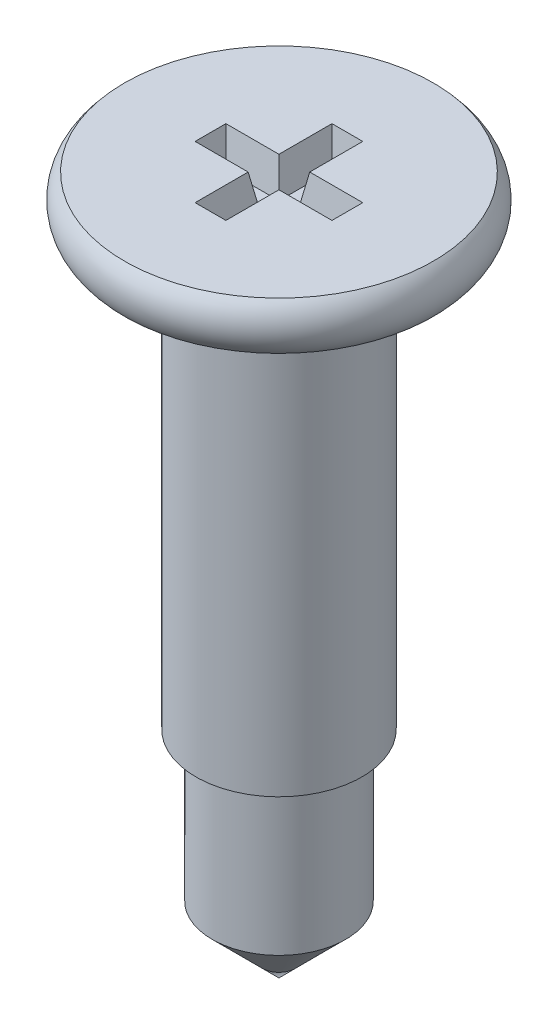
ISO-10303-21;
HEADER;
FILE_DESCRIPTION(('STEP AP214'),'2;1');
FILE_NAME('part.step','',(''),(''),'','','');
FILE_SCHEMA(('AUTOMOTIVE_DESIGN { 1 0 10303 214 1 1 1 1 }'));
ENDSEC;
DATA;
#1=APPLICATION_CONTEXT('core data for automotive mechanical design processes');
#2=APPLICATION_PROTOCOL_DEFINITION('international standard','automotive_design',2000,#1);
#3=PRODUCT_CONTEXT('',#1,'mechanical');
#4=PRODUCT('Part','Part','',(#3));
#5=PRODUCT_RELATED_PRODUCT_CATEGORY('part','',(#4));
#6=PRODUCT_DEFINITION_FORMATION('','',#4);
#7=PRODUCT_DEFINITION_CONTEXT('part definition',#1,'design');
#8=PRODUCT_DEFINITION('design','',#6,#7);
#9=PRODUCT_DEFINITION_SHAPE('','',#8);
#10=(LENGTH_UNIT() NAMED_UNIT(*) SI_UNIT(.MILLI.,.METRE.));
#11=(NAMED_UNIT(*) PLANE_ANGLE_UNIT() SI_UNIT($,.RADIAN.));
#12=(NAMED_UNIT(*) SI_UNIT($,.STERADIAN.) SOLID_ANGLE_UNIT());
#13=UNCERTAINTY_MEASURE_WITH_UNIT(LENGTH_MEASURE(1.E-05),#10,'distance_accuracy_value','');
#14=(GEOMETRIC_REPRESENTATION_CONTEXT(3) GLOBAL_UNCERTAINTY_ASSIGNED_CONTEXT((#13)) GLOBAL_UNIT_ASSIGNED_CONTEXT((#10,
#11,#12)) REPRESENTATION_CONTEXT('',''));
#15=CARTESIAN_POINT('',(0.,0.,0.));
#16=DIRECTION('',(0.,0.,1.));
#17=DIRECTION('',(1.,0.,0.));
#18=AXIS2_PLACEMENT_3D('',#15,#16,#17);
#19=CARTESIAN_POINT('',(-2.42500000000001,0.,0.));
#20=DIRECTION('',(0.,-1.,0.));
#21=DIRECTION('',(1.,0.,0.));
#22=AXIS2_PLACEMENT_3D('',#19,#20,#21);
#23=PLANE('',#22);
#24=CARTESIAN_POINT('',(0.,0.,0.));
#25=DIRECTION('',(0.,1.,0.));
#26=DIRECTION('',(-1.,0.,0.));
#27=AXIS2_PLACEMENT_3D('',#24,#25,#26);
#28=CIRCLE('',#27,2.425);
#29=CARTESIAN_POINT('',(-2.425,0.,0.));
#30=VERTEX_POINT('',#29);
#31=EDGE_CURVE('E192',#30,#30,#28,.T.);
#32=ORIENTED_EDGE('',*,*,#31,.T.);
#33=EDGE_LOOP('',(#32));
#34=FACE_BOUND('',#33,.T.);
#35=CARTESIAN_POINT('',(0.,0.,0.));
#36=DIRECTION('',(0.,1.,0.));
#37=DIRECTION('',(-1.,0.,0.));
#38=AXIS2_PLACEMENT_3D('',#35,#36,#37);
#39=CIRCLE('',#38,4.51414284285428);
#40=CARTESIAN_POINT('',(-4.51414284285428,0.,0.));
#41=VERTEX_POINT('',#40);
#42=EDGE_CURVE('E13',#41,#41,#39,.T.);
#43=ORIENTED_EDGE('',*,*,#42,.F.);
#44=EDGE_LOOP('',(#43));
#45=FACE_BOUND('',#44,.T.);
#46=ADVANCED_FACE('F49',(#34,#45),#23,.T.);
#47=CARTESIAN_POINT('',(0.,0.699999999999923,0.));
#48=DIRECTION('',(0.,1.,0.));
#49=DIRECTION('',(-1.,0.,0.));
#50=AXIS2_PLACEMENT_3D('',#47,#48,#49);
#51=TOROIDAL_SURFACE('',#50,3.8,1.);
#52=ORIENTED_EDGE('',*,*,#42,.T.);
#53=EDGE_LOOP('',(#52));
#54=FACE_BOUND('',#53,.T.);
#55=CARTESIAN_POINT('',(0.,1.40000000000007,0.));
#56=DIRECTION('',(0.,1.,0.));
#57=DIRECTION('',(-1.,0.,0.));
#58=AXIS2_PLACEMENT_3D('',#55,#56,#57);
#59=CIRCLE('',#58,4.51414284285428);
#60=CARTESIAN_POINT('',(-4.51414284285428,1.40000000000007,0.));
#61=VERTEX_POINT('',#60);
#62=EDGE_CURVE('E56',#61,#61,#59,.T.);
#63=ORIENTED_EDGE('',*,*,#62,.F.);
#64=EDGE_LOOP('',(#63));
#65=FACE_BOUND('',#64,.T.);
#66=ADVANCED_FACE('F256',(#54,#65),#51,.T.);
#67=CARTESIAN_POINT('',(-4.51414284285429,1.40000000000007,0.));
#68=DIRECTION('',(0.,1.,0.));
#69=DIRECTION('',(-1.,0.,0.));
#70=AXIS2_PLACEMENT_3D('',#67,#68,#69);
#71=PLANE('',#70);
#72=DIRECTION('',(-1.,0.,0.));
#73=VECTOR('',#72,1.);
#74=CARTESIAN_POINT('',(-0.450000000000006,1.40000000000007,-2.));
#75=LINE('',#74,#73);
#76=CARTESIAN_POINT('',(0.450000000000006,1.40000000000007,-2.));
#77=VERTEX_POINT('',#76);
#78=CARTESIAN_POINT('',(-0.450000000000006,1.40000000000007,-2.));
#79=VERTEX_POINT('',#78);
#80=EDGE_CURVE('E63',#77,#79,#75,.T.);
#81=ORIENTED_EDGE('',*,*,#80,.F.);
#82=DIRECTION('',(0.,0.,-1.));
#83=VECTOR('',#82,1.);
#84=CARTESIAN_POINT('',(0.450000000000006,1.40000000000007,-2.));
#85=LINE('',#84,#83);
#86=CARTESIAN_POINT('',(0.450000000000006,1.40000000000007,-0.450000000000006));
#87=VERTEX_POINT('',#86);
#88=EDGE_CURVE('E186',#87,#77,#85,.T.);
#89=ORIENTED_EDGE('',*,*,#88,.F.);
#90=DIRECTION('',(-1.,0.,0.));
#91=VECTOR('',#90,1.);
#92=CARTESIAN_POINT('',(0.450000000000006,1.40000000000007,-0.450000000000006));
#93=LINE('',#92,#91);
#94=CARTESIAN_POINT('',(2.,1.40000000000007,-0.450000000000006));
#95=VERTEX_POINT('',#94);
#96=EDGE_CURVE('E183',#95,#87,#93,.T.);
#97=ORIENTED_EDGE('',*,*,#96,.F.);
#98=DIRECTION('',(0.,0.,-1.));
#99=VECTOR('',#98,1.);
#100=CARTESIAN_POINT('',(2.,1.40000000000007,0.450000000000006));
#101=LINE('',#100,#99);
#102=CARTESIAN_POINT('',(2.,1.40000000000007,0.450000000000006));
#103=VERTEX_POINT('',#102);
#104=EDGE_CURVE('E180',#103,#95,#101,.T.);
#105=ORIENTED_EDGE('',*,*,#104,.F.);
#106=DIRECTION('',(1.,0.,0.));
#107=VECTOR('',#106,1.);
#108=CARTESIAN_POINT('',(0.450000000000006,1.40000000000007,0.450000000000006));
#109=LINE('',#108,#107);
#110=CARTESIAN_POINT('',(0.450000000000006,1.40000000000007,0.450000000000006));
#111=VERTEX_POINT('',#110);
#112=EDGE_CURVE('E177',#111,#103,#109,.T.);
#113=ORIENTED_EDGE('',*,*,#112,.F.);
#114=DIRECTION('',(0.,0.,-1.));
#115=VECTOR('',#114,1.);
#116=CARTESIAN_POINT('',(0.450000000000006,1.40000000000007,2.));
#117=LINE('',#116,#115);
#118=CARTESIAN_POINT('',(0.450000000000006,1.40000000000007,2.));
#119=VERTEX_POINT('',#118);
#120=EDGE_CURVE('E174',#119,#111,#117,.T.);
#121=ORIENTED_EDGE('',*,*,#120,.F.);
#122=DIRECTION('',(1.,0.,0.));
#123=VECTOR('',#122,1.);
#124=CARTESIAN_POINT('',(-0.450000000000006,1.40000000000007,2.));
#125=LINE('',#124,#123);
#126=CARTESIAN_POINT('',(-0.450000000000006,1.40000000000007,2.));
#127=VERTEX_POINT('',#126);
#128=EDGE_CURVE('E171',#127,#119,#125,.T.);
#129=ORIENTED_EDGE('',*,*,#128,.F.);
#130=DIRECTION('',(0.,0.,1.));
#131=VECTOR('',#130,1.);
#132=CARTESIAN_POINT('',(-0.450000000000006,1.40000000000007,2.));
#133=LINE('',#132,#131);
#134=CARTESIAN_POINT('',(-0.450000000000006,1.40000000000007,0.450000000000006));
#135=VERTEX_POINT('',#134);
#136=EDGE_CURVE('E168',#135,#127,#133,.T.);
#137=ORIENTED_EDGE('',*,*,#136,.F.);
#138=DIRECTION('',(1.,0.,0.));
#139=VECTOR('',#138,1.);
#140=CARTESIAN_POINT('',(-0.450000000000006,1.40000000000007,0.450000000000006));
#141=LINE('',#140,#139);
#142=CARTESIAN_POINT('',(-2.,1.40000000000007,0.450000000000006));
#143=VERTEX_POINT('',#142);
#144=EDGE_CURVE('E162',#143,#135,#141,.T.);
#145=ORIENTED_EDGE('',*,*,#144,.F.);
#146=DIRECTION('',(0.,0.,1.));
#147=VECTOR('',#146,1.);
#148=CARTESIAN_POINT('',(-2.,1.40000000000007,0.450000000000006));
#149=LINE('',#148,#147);
#150=CARTESIAN_POINT('',(-2.,1.40000000000007,-0.450000000000006));
#151=VERTEX_POINT('',#150);
#152=EDGE_CURVE('E160',#151,#143,#149,.T.);
#153=ORIENTED_EDGE('',*,*,#152,.F.);
#154=DIRECTION('',(-1.,0.,0.));
#155=VECTOR('',#154,1.);
#156=CARTESIAN_POINT('',(-0.450000000000006,1.40000000000007,-0.450000000000006));
#157=LINE('',#156,#155);
#158=CARTESIAN_POINT('',(-0.450000000000006,1.40000000000007,-0.450000000000006));
#159=VERTEX_POINT('',#158);
#160=EDGE_CURVE('E141',#159,#151,#157,.T.);
#161=ORIENTED_EDGE('',*,*,#160,.F.);
#162=DIRECTION('',(0.,0.,1.));
#163=VECTOR('',#162,1.);
#164=CARTESIAN_POINT('',(-0.450000000000006,1.40000000000007,-2.));
#165=LINE('',#164,#163);
#166=EDGE_CURVE('E152',#79,#159,#165,.T.);
#167=ORIENTED_EDGE('',*,*,#166,.F.);
#168=EDGE_LOOP('',(#81,#89,#97,#105,#113,#121,#129,#137,#145,#153,#161,#167));
#169=FACE_BOUND('',#168,.T.);
#170=ORIENTED_EDGE('',*,*,#62,.T.);
#171=EDGE_LOOP('',(#170));
#172=FACE_BOUND('',#171,.T.);
#173=ADVANCED_FACE('F156',(#169,#172),#71,.T.);
#174=CARTESIAN_POINT('',(0.,-17.05,0.));
#175=DIRECTION('',(0.,1.,0.));
#176=DIRECTION('',(-1.,0.,0.));
#177=AXIS2_PLACEMENT_3D('',#174,#175,#176);
#178=CONICAL_SURFACE('',#177,1.95,0.785398163397443);
#179=CARTESIAN_POINT('',(0.,-18.9999999999999,0.));
#180=VERTEX_POINT('',#179);
#181=VERTEX_LOOP('',#180);
#182=FACE_BOUND('',#181,.T.);
#183=CARTESIAN_POINT('',(0.,-17.05,0.));
#184=DIRECTION('',(0.,1.,0.));
#185=DIRECTION('',(-1.,0.,0.));
#186=AXIS2_PLACEMENT_3D('',#183,#184,#185);
#187=CIRCLE('',#186,1.95);
#188=CARTESIAN_POINT('',(-1.95,-17.05,0.));
#189=VERTEX_POINT('',#188);
#190=EDGE_CURVE('E251',#189,#189,#187,.T.);
#191=ORIENTED_EDGE('',*,*,#190,.F.);
#192=EDGE_LOOP('',(#191));
#193=FACE_BOUND('',#192,.T.);
#194=ADVANCED_FACE('F263',(#182,#193),#178,.T.);
#195=CARTESIAN_POINT('',(0.,-18.9999999999999,0.));
#196=DIRECTION('',(0.,1.,0.));
#197=DIRECTION('',(-1.,0.,0.));
#198=AXIS2_PLACEMENT_3D('',#195,#196,#197);
#199=CYLINDRICAL_SURFACE('',#198,1.95);
#200=ORIENTED_EDGE('',*,*,#190,.T.);
#201=EDGE_LOOP('',(#200));
#202=FACE_BOUND('',#201,.T.);
#203=CARTESIAN_POINT('',(0.,-12.6999999999999,0.));
#204=DIRECTION('',(0.,1.,0.));
#205=DIRECTION('',(-1.,0.,0.));
#206=AXIS2_PLACEMENT_3D('',#203,#204,#205);
#207=CIRCLE('',#206,1.95);
#208=CARTESIAN_POINT('',(-1.95,-12.6999999999999,0.));
#209=VERTEX_POINT('',#208);
#210=EDGE_CURVE('E248',#209,#209,#207,.T.);
#211=ORIENTED_EDGE('',*,*,#210,.F.);
#212=EDGE_LOOP('',(#211));
#213=FACE_BOUND('',#212,.T.);
#214=ADVANCED_FACE('F269',(#202,#213),#199,.T.);
#215=CARTESIAN_POINT('',(-2.42500000000001,-12.6999999999999,0.));
#216=DIRECTION('',(0.,-1.,0.));
#217=DIRECTION('',(1.,0.,0.));
#218=AXIS2_PLACEMENT_3D('',#215,#216,#217);
#219=PLANE('',#218);
#220=ORIENTED_EDGE('',*,*,#210,.T.);
#221=EDGE_LOOP('',(#220));
#222=FACE_BOUND('',#221,.T.);
#223=CARTESIAN_POINT('',(0.,-12.6999999999999,0.));
#224=DIRECTION('',(0.,1.,0.));
#225=DIRECTION('',(-1.,0.,0.));
#226=AXIS2_PLACEMENT_3D('',#223,#224,#225);
#227=CIRCLE('',#226,2.425);
#228=CARTESIAN_POINT('',(-2.425,-12.6999999999999,0.));
#229=VERTEX_POINT('',#228);
#230=EDGE_CURVE('E245',#229,#229,#227,.T.);
#231=ORIENTED_EDGE('',*,*,#230,.F.);
#232=EDGE_LOOP('',(#231));
#233=FACE_BOUND('',#232,.T.);
#234=ADVANCED_FACE('F272',(#222,#233),#219,.T.);
#235=CARTESIAN_POINT('',(0.,-18.9999999999999,0.));
#236=DIRECTION('',(0.,1.,0.));
#237=DIRECTION('',(-1.,0.,0.));
#238=AXIS2_PLACEMENT_3D('',#235,#236,#237);
#239=CYLINDRICAL_SURFACE('',#238,2.425);
#240=ORIENTED_EDGE('',*,*,#230,.T.);
#241=EDGE_LOOP('',(#240));
#242=FACE_BOUND('',#241,.T.);
#243=ORIENTED_EDGE('',*,*,#31,.F.);
#244=EDGE_LOOP('',(#243));
#245=FACE_BOUND('',#244,.T.);
#246=ADVANCED_FACE('F276',(#242,#245),#239,.T.);
#247=CARTESIAN_POINT('',(-0.450000000000006,1.40000000000007,-2.));
#248=DIRECTION('',(0.,-0.173648177666931,-0.984807753012208));
#249=DIRECTION('',(0.,0.984807753012208,-0.173648177666931));
#250=AXIS2_PLACEMENT_3D('',#247,#248,#249);
#251=PLANE('',#250);
#252=ORIENTED_EDGE('',*,*,#80,.T.);
#253=DIRECTION('',(-0.171087869746036,0.970287525247813,-0.171087869746036));
#254=VECTOR('',#253,1.);
#255=CARTESIAN_POINT('',(-0.450000000000006,1.40000000000007,-2.));
#256=LINE('',#255,#254);
#257=CARTESIAN_POINT('',(-0.273673019291543,0.399999999999956,-1.82367301929154));
#258=VERTEX_POINT('',#257);
#259=EDGE_CURVE('E149',#258,#79,#256,.T.);
#260=ORIENTED_EDGE('',*,*,#259,.F.);
#261=DIRECTION('',(-1.,0.,0.));
#262=VECTOR('',#261,1.);
#263=CARTESIAN_POINT('',(-0.450000000000006,0.399999999999956,-1.82367301929154));
#264=LINE('',#263,#262);
#265=CARTESIAN_POINT('',(0.273673019291543,0.399999999999956,-1.82367301929154));
#266=VERTEX_POINT('',#265);
#267=EDGE_CURVE('E189',#266,#258,#264,.T.);
#268=ORIENTED_EDGE('',*,*,#267,.F.);
#269=DIRECTION('',(0.171087869746036,0.970287525247814,-0.171087869746036));
#270=VECTOR('',#269,1.);
#271=CARTESIAN_POINT('',(0.450000000000006,1.40000000000007,-2.));
#272=LINE('',#271,#270);
#273=EDGE_CURVE('E190',#266,#77,#272,.T.);
#274=ORIENTED_EDGE('',*,*,#273,.T.);
#275=EDGE_LOOP('',(#252,#260,#268,#274));
#276=FACE_BOUND('',#275,.T.);
#277=ADVANCED_FACE('F280',(#276),#251,.F.);
#278=CARTESIAN_POINT('',(0.450000000000006,1.40000000000007,-2.));
#279=DIRECTION('',(0.984807753012208,-0.173648177666931,0.));
#280=DIRECTION('',(0.173648177666931,0.984807753012208,0.));
#281=AXIS2_PLACEMENT_3D('',#278,#279,#280);
#282=PLANE('',#281);
#283=ORIENTED_EDGE('',*,*,#88,.T.);
#284=ORIENTED_EDGE('',*,*,#273,.F.);
#285=DIRECTION('',(0.,0.,-1.));
#286=VECTOR('',#285,1.);
#287=CARTESIAN_POINT('',(0.273673019291543,0.399999999999956,-2.));
#288=LINE('',#287,#286);
#289=CARTESIAN_POINT('',(0.273673019291543,0.399999999999956,-0.273673019291543));
#290=VERTEX_POINT('',#289);
#291=EDGE_CURVE('E194',#290,#266,#288,.T.);
#292=ORIENTED_EDGE('',*,*,#291,.F.);
#293=DIRECTION('',(0.171087869746036,0.970287525247814,-0.171087869746036));
#294=VECTOR('',#293,1.);
#295=CARTESIAN_POINT('',(0.495370141720075,1.65730685989041,-0.495370141720075));
#296=LINE('',#295,#294);
#297=EDGE_CURVE('E193',#290,#87,#296,.T.);
#298=ORIENTED_EDGE('',*,*,#297,.T.);
#299=EDGE_LOOP('',(#283,#284,#292,#298));
#300=FACE_BOUND('',#299,.T.);
#301=ADVANCED_FACE('F282',(#300),#282,.F.);
#302=CARTESIAN_POINT('',(0.450000000000006,1.40000000000007,-0.450000000000006));
#303=DIRECTION('',(0.,-0.173648177666931,-0.984807753012208));
#304=DIRECTION('',(0.,0.984807753012208,-0.173648177666931));
#305=AXIS2_PLACEMENT_3D('',#302,#303,#304);
#306=PLANE('',#305);
#307=ORIENTED_EDGE('',*,*,#96,.T.);
#308=ORIENTED_EDGE('',*,*,#297,.F.);
#309=DIRECTION('',(-1.,0.,0.));
#310=VECTOR('',#309,1.);
#311=CARTESIAN_POINT('',(0.450000000000006,0.399999999999956,-0.273673019291543));
#312=LINE('',#311,#310);
#313=CARTESIAN_POINT('',(1.82367301929154,0.399999999999956,-0.273673019291543));
#314=VERTEX_POINT('',#313);
#315=EDGE_CURVE('E217',#314,#290,#312,.T.);
#316=ORIENTED_EDGE('',*,*,#315,.F.);
#317=DIRECTION('',(0.171087869746036,0.970287525247814,-0.171087869746036));
#318=VECTOR('',#317,1.);
#319=CARTESIAN_POINT('',(1.97365604674321,1.25059601683786,-0.423656046743215));
#320=LINE('',#319,#318);
#321=EDGE_CURVE('E209',#314,#95,#320,.T.);
#322=ORIENTED_EDGE('',*,*,#321,.T.);
#323=EDGE_LOOP('',(#307,#308,#316,#322));
#324=FACE_BOUND('',#323,.T.);
#325=ADVANCED_FACE('F285',(#324),#306,.F.);
#326=CARTESIAN_POINT('',(2.,1.40000000000007,0.450000000000006));
#327=DIRECTION('',(0.984807753012208,-0.173648177666931,0.));
#328=DIRECTION('',(0.173648177666931,0.984807753012208,0.));
#329=AXIS2_PLACEMENT_3D('',#326,#327,#328);
#330=PLANE('',#329);
#331=ORIENTED_EDGE('',*,*,#104,.T.);
#332=ORIENTED_EDGE('',*,*,#321,.F.);
#333=DIRECTION('',(0.,0.,-1.));
#334=VECTOR('',#333,1.);
#335=CARTESIAN_POINT('',(1.82367301929154,0.399999999999956,0.450000000000006));
#336=LINE('',#335,#334);
#337=CARTESIAN_POINT('',(1.82367301929154,0.399999999999956,0.273673019291543));
#338=VERTEX_POINT('',#337);
#339=EDGE_CURVE('E220',#338,#314,#336,.T.);
#340=ORIENTED_EDGE('',*,*,#339,.F.);
#341=DIRECTION('',(0.171087869746036,0.970287525247814,0.171087869746036));
#342=VECTOR('',#341,1.);
#343=CARTESIAN_POINT('',(1.95462985827993,1.14269314010951,0.404629858279937));
#344=LINE('',#343,#342);
#345=EDGE_CURVE('E207',#338,#103,#344,.T.);
#346=ORIENTED_EDGE('',*,*,#345,.T.);
#347=EDGE_LOOP('',(#331,#332,#340,#346));
#348=FACE_BOUND('',#347,.T.);
#349=ADVANCED_FACE('F289',(#348),#330,.F.);
#350=CARTESIAN_POINT('',(0.450000000000006,1.40000000000007,0.450000000000006));
#351=DIRECTION('',(0.,-0.173648177666931,0.984807753012208));
#352=DIRECTION('',(0.,-0.984807753012208,-0.173648177666931));
#353=AXIS2_PLACEMENT_3D('',#350,#351,#352);
#354=PLANE('',#353);
#355=ORIENTED_EDGE('',*,*,#112,.T.);
#356=ORIENTED_EDGE('',*,*,#345,.F.);
#357=DIRECTION('',(1.,0.,0.));
#358=VECTOR('',#357,1.);
#359=CARTESIAN_POINT('',(0.450000000000006,0.399999999999956,0.273673019291543));
#360=LINE('',#359,#358);
#361=CARTESIAN_POINT('',(0.273673019291543,0.399999999999956,0.273673019291543));
#362=VERTEX_POINT('',#361);
#363=EDGE_CURVE('E223',#362,#338,#360,.T.);
#364=ORIENTED_EDGE('',*,*,#363,.F.);
#365=DIRECTION('',(0.171087869746036,0.970287525247814,0.171087869746036));
#366=VECTOR('',#365,1.);
#367=CARTESIAN_POINT('',(0.450000000000006,1.40000000000007,0.450000000000006));
#368=LINE('',#367,#366);
#369=EDGE_CURVE('E205',#362,#111,#368,.T.);
#370=ORIENTED_EDGE('',*,*,#369,.T.);
#371=EDGE_LOOP('',(#355,#356,#364,#370));
#372=FACE_BOUND('',#371,.T.);
#373=ADVANCED_FACE('F293',(#372),#354,.F.);
#374=CARTESIAN_POINT('',(0.450000000000006,1.40000000000007,2.));
#375=DIRECTION('',(0.984807753012208,-0.173648177666931,0.));
#376=DIRECTION('',(0.173648177666931,0.984807753012208,0.));
#377=AXIS2_PLACEMENT_3D('',#374,#375,#376);
#378=PLANE('',#377);
#379=ORIENTED_EDGE('',*,*,#120,.T.);
#380=ORIENTED_EDGE('',*,*,#369,.F.);
#381=DIRECTION('',(0.,0.,-1.));
#382=VECTOR('',#381,1.);
#383=CARTESIAN_POINT('',(0.273673019291543,0.399999999999956,2.));
#384=LINE('',#383,#382);
#385=CARTESIAN_POINT('',(0.273673019291543,0.399999999999956,1.82367301929154));
#386=VERTEX_POINT('',#385);
#387=EDGE_CURVE('E226',#386,#362,#384,.T.);
#388=ORIENTED_EDGE('',*,*,#387,.F.);
#389=DIRECTION('',(0.171087869746036,0.970287525247814,0.171087869746036));
#390=VECTOR('',#389,1.);
#391=CARTESIAN_POINT('',(0.423656046743159,1.25059601683786,1.97365604674321));
#392=LINE('',#391,#390);
#393=EDGE_CURVE('E203',#386,#119,#392,.T.);
#394=ORIENTED_EDGE('',*,*,#393,.T.);
#395=EDGE_LOOP('',(#379,#380,#388,#394));
#396=FACE_BOUND('',#395,.T.);
#397=ADVANCED_FACE('F297',(#396),#378,.F.);
#398=CARTESIAN_POINT('',(-0.450000000000006,1.40000000000007,2.));
#399=DIRECTION('',(0.,-0.173648177666931,0.984807753012208));
#400=DIRECTION('',(0.,-0.984807753012208,-0.173648177666931));
#401=AXIS2_PLACEMENT_3D('',#398,#399,#400);
#402=PLANE('',#401);
#403=ORIENTED_EDGE('',*,*,#128,.T.);
#404=ORIENTED_EDGE('',*,*,#393,.F.);
#405=DIRECTION('',(1.,0.,0.));
#406=VECTOR('',#405,1.);
#407=CARTESIAN_POINT('',(-0.450000000000006,0.399999999999956,1.82367301929154));
#408=LINE('',#407,#406);
#409=CARTESIAN_POINT('',(-0.273673019291543,0.399999999999956,1.82367301929154));
#410=VERTEX_POINT('',#409);
#411=EDGE_CURVE('E229',#410,#386,#408,.T.);
#412=ORIENTED_EDGE('',*,*,#411,.F.);
#413=DIRECTION('',(-0.171087869746036,0.970287525247814,0.171087869746036));
#414=VECTOR('',#413,1.);
#415=CARTESIAN_POINT('',(-0.450000000000006,1.40000000000007,2.));
#416=LINE('',#415,#414);
#417=EDGE_CURVE('E201',#410,#127,#416,.T.);
#418=ORIENTED_EDGE('',*,*,#417,.T.);
#419=EDGE_LOOP('',(#403,#404,#412,#418));
#420=FACE_BOUND('',#419,.T.);
#421=ADVANCED_FACE('F301',(#420),#402,.F.);
#422=CARTESIAN_POINT('',(-0.450000000000006,1.40000000000007,2.));
#423=DIRECTION('',(-0.984807753012208,-0.173648177666931,0.));
#424=DIRECTION('',(0.173648177666931,-0.984807753012208,0.));
#425=AXIS2_PLACEMENT_3D('',#422,#423,#424);
#426=PLANE('',#425);
#427=ORIENTED_EDGE('',*,*,#136,.T.);
#428=ORIENTED_EDGE('',*,*,#417,.F.);
#429=DIRECTION('',(0.,0.,1.));
#430=VECTOR('',#429,1.);
#431=CARTESIAN_POINT('',(-0.273673019291543,0.399999999999956,2.));
#432=LINE('',#431,#430);
#433=CARTESIAN_POINT('',(-0.273673019291543,0.399999999999956,0.273673019291543));
#434=VERTEX_POINT('',#433);
#435=EDGE_CURVE('E232',#434,#410,#432,.T.);
#436=ORIENTED_EDGE('',*,*,#435,.F.);
#437=DIRECTION('',(-0.171087869746036,0.970287525247814,0.171087869746036));
#438=VECTOR('',#437,1.);
#439=CARTESIAN_POINT('',(-0.495370141720075,1.65730685989041,0.495370141720075));
#440=LINE('',#439,#438);
#441=EDGE_CURVE('E199',#434,#135,#440,.T.);
#442=ORIENTED_EDGE('',*,*,#441,.T.);
#443=EDGE_LOOP('',(#427,#428,#436,#442));
#444=FACE_BOUND('',#443,.T.);
#445=ADVANCED_FACE('F305',(#444),#426,.F.);
#446=CARTESIAN_POINT('',(-0.450000000000006,1.40000000000007,0.450000000000006));
#447=DIRECTION('',(0.,-0.173648177666931,0.984807753012208));
#448=DIRECTION('',(0.,-0.984807753012208,-0.173648177666931));
#449=AXIS2_PLACEMENT_3D('',#446,#447,#448);
#450=PLANE('',#449);
#451=ORIENTED_EDGE('',*,*,#144,.T.);
#452=ORIENTED_EDGE('',*,*,#441,.F.);
#453=DIRECTION('',(1.,0.,0.));
#454=VECTOR('',#453,1.);
#455=CARTESIAN_POINT('',(-0.450000000000006,0.399999999999956,0.273673019291543));
#456=LINE('',#455,#454);
#457=CARTESIAN_POINT('',(-1.82367301929154,0.399999999999956,0.273673019291543));
#458=VERTEX_POINT('',#457);
#459=EDGE_CURVE('E235',#458,#434,#456,.T.);
#460=ORIENTED_EDGE('',*,*,#459,.F.);
#461=DIRECTION('',(-0.171087869746036,0.970287525247814,0.171087869746036));
#462=VECTOR('',#461,1.);
#463=CARTESIAN_POINT('',(-2.,1.40000000000007,0.450000000000006));
#464=LINE('',#463,#462);
#465=EDGE_CURVE('E197',#458,#143,#464,.T.);
#466=ORIENTED_EDGE('',*,*,#465,.T.);
#467=EDGE_LOOP('',(#451,#452,#460,#466));
#468=FACE_BOUND('',#467,.T.);
#469=ADVANCED_FACE('F309',(#468),#450,.F.);
#470=CARTESIAN_POINT('',(-2.,1.40000000000007,0.450000000000006));
#471=DIRECTION('',(-0.984807753012208,-0.173648177666931,0.));
#472=DIRECTION('',(0.173648177666931,-0.984807753012208,0.));
#473=AXIS2_PLACEMENT_3D('',#470,#471,#472);
#474=PLANE('',#473);
#475=ORIENTED_EDGE('',*,*,#152,.T.);
#476=ORIENTED_EDGE('',*,*,#465,.F.);
#477=DIRECTION('',(0.,0.,1.));
#478=VECTOR('',#477,1.);
#479=CARTESIAN_POINT('',(-1.82367301929154,0.399999999999956,0.450000000000006));
#480=LINE('',#479,#478);
#481=CARTESIAN_POINT('',(-1.82367301929154,0.399999999999956,-0.273673019291543));
#482=VERTEX_POINT('',#481);
#483=EDGE_CURVE('E238',#482,#458,#480,.T.);
#484=ORIENTED_EDGE('',*,*,#483,.F.);
#485=DIRECTION('',(-0.171087869746036,0.970287525247813,-0.171087869746036));
#486=VECTOR('',#485,1.);
#487=CARTESIAN_POINT('',(-1.95462985827993,1.14269314010951,-0.404629858279937));
#488=LINE('',#487,#486);
#489=EDGE_CURVE('E148',#482,#151,#488,.T.);
#490=ORIENTED_EDGE('',*,*,#489,.T.);
#491=EDGE_LOOP('',(#475,#476,#484,#490));
#492=FACE_BOUND('',#491,.T.);
#493=ADVANCED_FACE('F313',(#492),#474,.F.);
#494=CARTESIAN_POINT('',(-0.450000000000006,1.40000000000007,-0.450000000000006));
#495=DIRECTION('',(0.,-0.173648177666931,-0.984807753012208));
#496=DIRECTION('',(0.,0.984807753012208,-0.173648177666931));
#497=AXIS2_PLACEMENT_3D('',#494,#495,#496);
#498=PLANE('',#497);
#499=ORIENTED_EDGE('',*,*,#160,.T.);
#500=ORIENTED_EDGE('',*,*,#489,.F.);
#501=DIRECTION('',(-1.,0.,0.));
#502=VECTOR('',#501,1.);
#503=CARTESIAN_POINT('',(-0.450000000000006,0.399999999999956,-0.273673019291543));
#504=LINE('',#503,#502);
#505=CARTESIAN_POINT('',(-0.273673019291543,0.399999999999956,-0.273673019291543));
#506=VERTEX_POINT('',#505);
#507=EDGE_CURVE('E144',#506,#482,#504,.T.);
#508=ORIENTED_EDGE('',*,*,#507,.F.);
#509=DIRECTION('',(-0.171087869746036,0.970287525247813,-0.171087869746036));
#510=VECTOR('',#509,1.);
#511=CARTESIAN_POINT('',(-0.450000000000006,1.40000000000007,-0.450000000000006));
#512=LINE('',#511,#510);
#513=EDGE_CURVE('E137',#506,#159,#512,.T.);
#514=ORIENTED_EDGE('',*,*,#513,.T.);
#515=EDGE_LOOP('',(#499,#500,#508,#514));
#516=FACE_BOUND('',#515,.T.);
#517=ADVANCED_FACE('F139',(#516),#498,.F.);
#518=CARTESIAN_POINT('',(-0.450000000000006,1.40000000000007,-2.));
#519=DIRECTION('',(-0.984807753012208,-0.173648177666931,0.));
#520=DIRECTION('',(0.173648177666931,-0.984807753012208,0.));
#521=AXIS2_PLACEMENT_3D('',#518,#519,#520);
#522=PLANE('',#521);
#523=ORIENTED_EDGE('',*,*,#166,.T.);
#524=ORIENTED_EDGE('',*,*,#513,.F.);
#525=DIRECTION('',(0.,0.,1.));
#526=VECTOR('',#525,1.);
#527=CARTESIAN_POINT('',(-0.273673019291543,0.399999999999956,-2.));
#528=LINE('',#527,#526);
#529=EDGE_CURVE('E214',#258,#506,#528,.T.);
#530=ORIENTED_EDGE('',*,*,#529,.F.);
#531=ORIENTED_EDGE('',*,*,#259,.T.);
#532=EDGE_LOOP('',(#523,#524,#530,#531));
#533=FACE_BOUND('',#532,.T.);
#534=ADVANCED_FACE('F153',(#533),#522,.F.);
#535=CARTESIAN_POINT('',(0.,0.399999999999956,0.));
#536=DIRECTION('',(0.,-1.,0.));
#537=DIRECTION('',(0.,0.,-1.));
#538=AXIS2_PLACEMENT_3D('',#535,#536,#537);
#539=PLANE('',#538);
#540=ORIENTED_EDGE('',*,*,#267,.T.);
#541=ORIENTED_EDGE('',*,*,#529,.T.);
#542=ORIENTED_EDGE('',*,*,#507,.T.);
#543=ORIENTED_EDGE('',*,*,#483,.T.);
#544=ORIENTED_EDGE('',*,*,#459,.T.);
#545=ORIENTED_EDGE('',*,*,#435,.T.);
#546=ORIENTED_EDGE('',*,*,#411,.T.);
#547=ORIENTED_EDGE('',*,*,#387,.T.);
#548=ORIENTED_EDGE('',*,*,#363,.T.);
#549=ORIENTED_EDGE('',*,*,#339,.T.);
#550=ORIENTED_EDGE('',*,*,#315,.T.);
#551=ORIENTED_EDGE('',*,*,#291,.T.);
#552=EDGE_LOOP('',(#540,#541,#542,#543,#544,#545,#546,#547,#548,#549,#550,#551));
#553=FACE_BOUND('',#552,.T.);
#554=ADVANCED_FACE('F322',(#553),#539,.F.);
#555=CLOSED_SHELL('',(#46,#66,#173,#194,#214,#234,#246,#277,#301,#325,#349,#373,#397,#421,#445,
#469,#493,#517,#534,#554));
#556=MANIFOLD_SOLID_BREP('B2',#555);
#557=ADVANCED_BREP_SHAPE_REPRESENTATION('',(#18,#556),#14);
#558=SHAPE_DEFINITION_REPRESENTATION(#9,#557);
ENDSEC;
END-ISO-10303-21;
